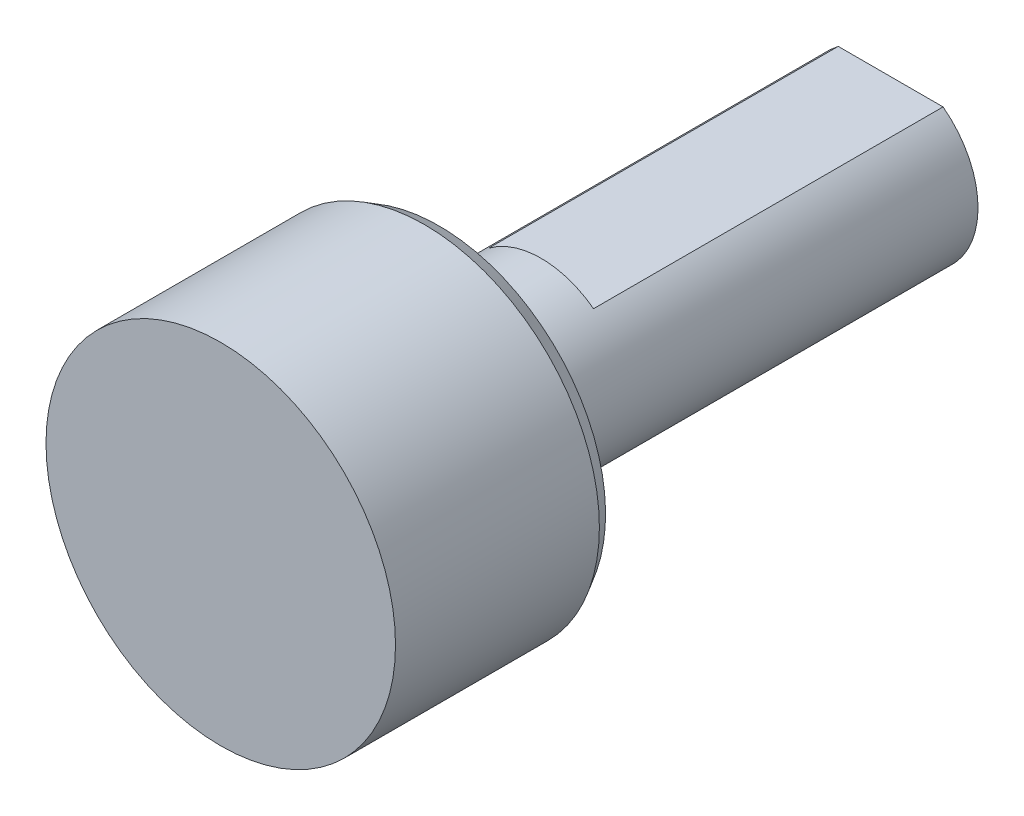
ISO-10303-21;
HEADER;
FILE_DESCRIPTION(('STEP AP214'),'2;1');
FILE_NAME('part.step','',(''),(''),'','','');
FILE_SCHEMA(('AUTOMOTIVE_DESIGN { 1 0 10303 214 1 1 1 1 }'));
ENDSEC;
DATA;
#1=APPLICATION_CONTEXT('core data for automotive mechanical design processes');
#2=APPLICATION_PROTOCOL_DEFINITION('international standard','automotive_design',2000,#1);
#3=PRODUCT_CONTEXT('',#1,'mechanical');
#4=PRODUCT('Part','Part','',(#3));
#5=PRODUCT_RELATED_PRODUCT_CATEGORY('part','',(#4));
#6=PRODUCT_DEFINITION_FORMATION('','',#4);
#7=PRODUCT_DEFINITION_CONTEXT('part definition',#1,'design');
#8=PRODUCT_DEFINITION('design','',#6,#7);
#9=PRODUCT_DEFINITION_SHAPE('','',#8);
#10=(LENGTH_UNIT() NAMED_UNIT(*) SI_UNIT(.MILLI.,.METRE.));
#11=(NAMED_UNIT(*) PLANE_ANGLE_UNIT() SI_UNIT($,.RADIAN.));
#12=(NAMED_UNIT(*) SI_UNIT($,.STERADIAN.) SOLID_ANGLE_UNIT());
#13=UNCERTAINTY_MEASURE_WITH_UNIT(LENGTH_MEASURE(1.E-05),#10,'distance_accuracy_value','');
#14=(GEOMETRIC_REPRESENTATION_CONTEXT(3) GLOBAL_UNCERTAINTY_ASSIGNED_CONTEXT((#13)) GLOBAL_UNIT_ASSIGNED_CONTEXT((#10,
#11,#12)) REPRESENTATION_CONTEXT('',''));
#15=CARTESIAN_POINT('',(0.,0.,0.));
#16=DIRECTION('',(0.,0.,1.));
#17=DIRECTION('',(1.,0.,0.));
#18=AXIS2_PLACEMENT_3D('',#15,#16,#17);
#19=CARTESIAN_POINT('',(0.,0.,0.));
#20=DIRECTION('',(0.,0.,1.));
#21=DIRECTION('',(0.,-1.,0.));
#22=AXIS2_PLACEMENT_3D('',#19,#20,#21);
#23=PLANE('',#22);
#24=CARTESIAN_POINT('',(0.,0.,0.));
#25=DIRECTION('',(0.,0.,1.));
#26=DIRECTION('',(0.,-1.,0.));
#27=AXIS2_PLACEMENT_3D('',#24,#25,#26);
#28=CIRCLE('',#27,6.);
#29=CARTESIAN_POINT('',(0.,-6.,0.));
#30=VERTEX_POINT('',#29);
#31=EDGE_CURVE('E76',#30,#30,#28,.T.);
#32=ORIENTED_EDGE('',*,*,#31,.T.);
#33=EDGE_LOOP('',(#32));
#34=FACE_BOUND('',#33,.T.);
#35=ADVANCED_FACE('F39',(#34),#23,.T.);
#36=CARTESIAN_POINT('',(0.,0.,-23.));
#37=DIRECTION('',(0.,0.,-1.));
#38=DIRECTION('',(0.,1.,0.));
#39=AXIS2_PLACEMENT_3D('',#36,#37,#38);
#40=PLANE('',#39);
#41=DIRECTION('',(1.,0.,0.));
#42=VECTOR('',#41,1.);
#43=CARTESIAN_POINT('',(-3.00000000000003,2.4,-23.));
#44=LINE('',#43,#42);
#45=CARTESIAN_POINT('',(-1.80000000000009,2.40000000000007,-23.));
#46=VERTEX_POINT('',#45);
#47=CARTESIAN_POINT('',(1.8,2.4,-23.));
#48=VERTEX_POINT('',#47);
#49=EDGE_CURVE('E55',#46,#48,#44,.T.);
#50=ORIENTED_EDGE('',*,*,#49,.T.);
#51=CARTESIAN_POINT('',(0.,0.,-23.));
#52=DIRECTION('',(0.,0.,1.));
#53=DIRECTION('',(0.,-1.,0.));
#54=AXIS2_PLACEMENT_3D('',#51,#52,#53);
#55=CIRCLE('',#54,3.);
#56=EDGE_CURVE('E70',#46,#48,#55,.T.);
#57=ORIENTED_EDGE('',*,*,#56,.F.);
#58=EDGE_LOOP('',(#50,#57));
#59=FACE_BOUND('',#58,.T.);
#60=ADVANCED_FACE('F91',(#59),#40,.T.);
#61=CARTESIAN_POINT('',(0.,0.,0.));
#62=DIRECTION('',(0.,0.,1.));
#63=DIRECTION('',(0.,-1.,0.));
#64=AXIS2_PLACEMENT_3D('',#61,#62,#63);
#65=CYLINDRICAL_SURFACE('',#64,3.);
#66=DIRECTION('',(0.,0.,1.));
#67=VECTOR('',#66,1.);
#68=CARTESIAN_POINT('',(-1.80000000000001,2.39999999999999,0.));
#69=LINE('',#68,#67);
#70=CARTESIAN_POINT('',(-1.8000000000001,2.40000000000003,-11.));
#71=VERTEX_POINT('',#70);
#72=EDGE_CURVE('E11',#46,#71,#69,.T.);
#73=ORIENTED_EDGE('',*,*,#72,.F.);
#74=ORIENTED_EDGE('',*,*,#56,.T.);
#75=DIRECTION('',(0.,0.,1.));
#76=VECTOR('',#75,1.);
#77=CARTESIAN_POINT('',(1.79999999999992,2.40000000000007,0.));
#78=LINE('',#77,#76);
#79=CARTESIAN_POINT('',(1.8,2.4,-11.));
#80=VERTEX_POINT('',#79);
#81=EDGE_CURVE('E46',#80,#48,#78,.F.);
#82=ORIENTED_EDGE('',*,*,#81,.F.);
#83=CARTESIAN_POINT('',(0.,0.,-11.));
#84=DIRECTION('',(0.,0.,1.));
#85=DIRECTION('',(1.,0.,0.));
#86=AXIS2_PLACEMENT_3D('',#83,#84,#85);
#87=CIRCLE('',#86,3.);
#88=EDGE_CURVE('E63',#71,#80,#87,.F.);
#89=ORIENTED_EDGE('',*,*,#88,.F.);
#90=EDGE_LOOP('',(#73,#74,#82,#89));
#91=FACE_BOUND('',#90,.T.);
#92=CARTESIAN_POINT('',(0.,1.38777878078145E-13,-7.50000000000001));
#93=DIRECTION('',(0.,0.,1.));
#94=DIRECTION('',(0.,-1.,0.));
#95=AXIS2_PLACEMENT_3D('',#92,#93,#94);
#96=CIRCLE('',#95,3.);
#97=CARTESIAN_POINT('',(0.,-2.99999999999986,-7.50000000000001));
#98=VERTEX_POINT('',#97);
#99=EDGE_CURVE('E87',#98,#98,#96,.T.);
#100=ORIENTED_EDGE('',*,*,#99,.F.);
#101=EDGE_LOOP('',(#100));
#102=FACE_BOUND('',#101,.T.);
#103=ADVANCED_FACE('F64',(#91,#102),#65,.T.);
#104=CARTESIAN_POINT('',(0.,3.,-7.50000000000001));
#105=DIRECTION('',(0.,0.,-1.));
#106=DIRECTION('',(0.,1.,0.));
#107=AXIS2_PLACEMENT_3D('',#104,#105,#106);
#108=PLANE('',#107);
#109=ORIENTED_EDGE('',*,*,#99,.T.);
#110=EDGE_LOOP('',(#109));
#111=FACE_BOUND('',#110,.T.);
#112=CARTESIAN_POINT('',(0.,1.38777878078145E-13,-7.50000000000001));
#113=DIRECTION('',(0.,0.,1.));
#114=DIRECTION('',(0.,-1.,0.));
#115=AXIS2_PLACEMENT_3D('',#112,#113,#114);
#116=CIRCLE('',#115,5.71132486540519);
#117=CARTESIAN_POINT('',(0.,-5.71132486540505,-7.50000000000001));
#118=VERTEX_POINT('',#117);
#119=EDGE_CURVE('E84',#118,#118,#116,.T.);
#120=ORIENTED_EDGE('',*,*,#119,.F.);
#121=EDGE_LOOP('',(#120));
#122=FACE_BOUND('',#121,.T.);
#123=ADVANCED_FACE('F97',(#111,#122),#108,.T.);
#124=CARTESIAN_POINT('',(0.,0.,-7.00000000000001));
#125=DIRECTION('',(0.,0.,1.));
#126=DIRECTION('',(0.,-1.,0.));
#127=AXIS2_PLACEMENT_3D('',#124,#125,#126);
#128=CONICAL_SURFACE('',#127,6.,0.5235987755983);
#129=ORIENTED_EDGE('',*,*,#119,.T.);
#130=EDGE_LOOP('',(#129));
#131=FACE_BOUND('',#130,.T.);
#132=CARTESIAN_POINT('',(0.,0.,-7.00000000000001));
#133=DIRECTION('',(0.,0.,1.));
#134=DIRECTION('',(0.,-1.,0.));
#135=AXIS2_PLACEMENT_3D('',#132,#133,#134);
#136=CIRCLE('',#135,6.);
#137=CARTESIAN_POINT('',(0.,-6.,-7.00000000000001));
#138=VERTEX_POINT('',#137);
#139=EDGE_CURVE('E81',#138,#138,#136,.T.);
#140=ORIENTED_EDGE('',*,*,#139,.F.);
#141=EDGE_LOOP('',(#140));
#142=FACE_BOUND('',#141,.T.);
#143=ADVANCED_FACE('F103',(#131,#142),#128,.T.);
#144=CARTESIAN_POINT('',(0.,0.,0.));
#145=DIRECTION('',(0.,0.,1.));
#146=DIRECTION('',(0.,-1.,0.));
#147=AXIS2_PLACEMENT_3D('',#144,#145,#146);
#148=CYLINDRICAL_SURFACE('',#147,6.);
#149=ORIENTED_EDGE('',*,*,#139,.T.);
#150=EDGE_LOOP('',(#149));
#151=FACE_BOUND('',#150,.T.);
#152=ORIENTED_EDGE('',*,*,#31,.F.);
#153=EDGE_LOOP('',(#152));
#154=FACE_BOUND('',#153,.T.);
#155=ADVANCED_FACE('F107',(#151,#154),#148,.T.);
#156=CARTESIAN_POINT('',(-3.00000000000003,2.4,-23.));
#157=DIRECTION('',(0.,-1.,0.));
#158=DIRECTION('',(0.,0.,-1.));
#159=AXIS2_PLACEMENT_3D('',#156,#157,#158);
#160=PLANE('',#159);
#161=ORIENTED_EDGE('',*,*,#81,.T.);
#162=ORIENTED_EDGE('',*,*,#49,.F.);
#163=ORIENTED_EDGE('',*,*,#72,.T.);
#164=DIRECTION('',(1.,0.,0.));
#165=VECTOR('',#164,1.);
#166=CARTESIAN_POINT('',(-3.,2.4,-11.));
#167=LINE('',#166,#165);
#168=EDGE_CURVE('E73',#71,#80,#167,.T.);
#169=ORIENTED_EDGE('',*,*,#168,.T.);
#170=EDGE_LOOP('',(#161,#162,#163,#169));
#171=FACE_BOUND('',#170,.T.);
#172=ADVANCED_FACE('F72',(#171),#160,.F.);
#173=CARTESIAN_POINT('',(-3.,2.99999999999999,-11.));
#174=DIRECTION('',(0.,0.,1.));
#175=DIRECTION('',(1.,0.,0.));
#176=AXIS2_PLACEMENT_3D('',#173,#174,#175);
#177=PLANE('',#176);
#178=ORIENTED_EDGE('',*,*,#168,.F.);
#179=ORIENTED_EDGE('',*,*,#88,.T.);
#180=EDGE_LOOP('',(#178,#179));
#181=FACE_BOUND('',#180,.T.);
#182=ADVANCED_FACE('F74',(#181),#177,.F.);
#183=CLOSED_SHELL('',(#35,#60,#103,#123,#143,#155,#172,#182));
#184=MANIFOLD_SOLID_BREP('B2',#183);
#185=ADVANCED_BREP_SHAPE_REPRESENTATION('',(#18,#184),#14);
#186=SHAPE_DEFINITION_REPRESENTATION(#9,#185);
ENDSEC;
END-ISO-10303-21;
